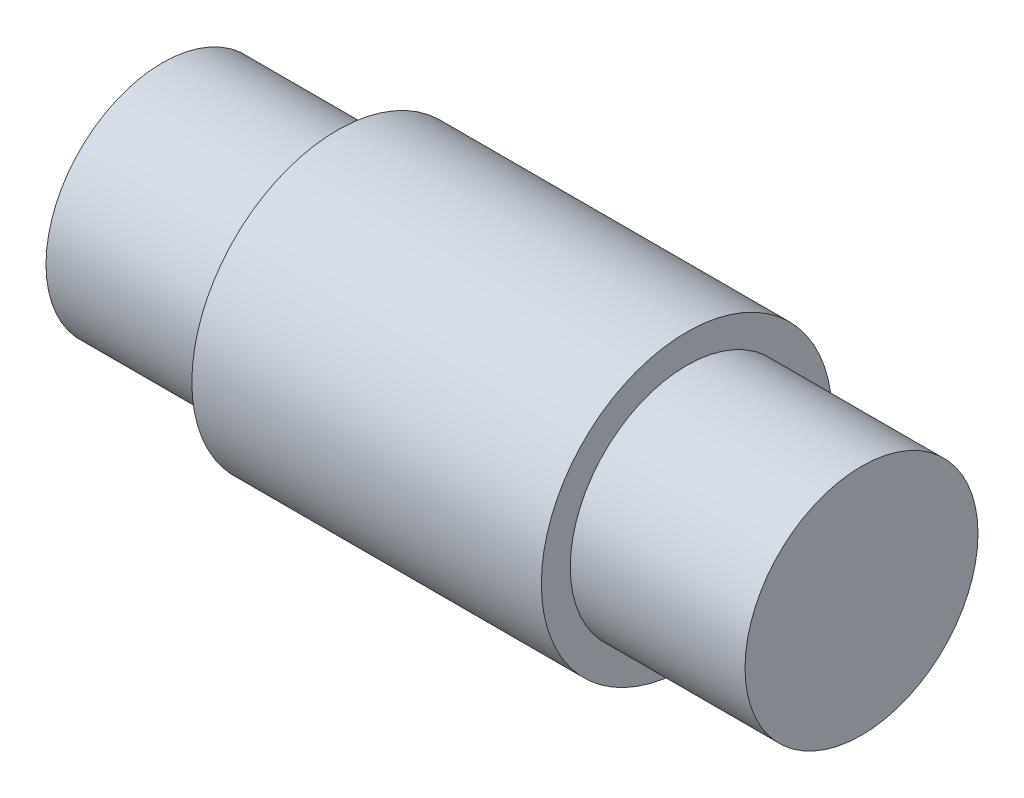
ISO-10303-21;
HEADER;
FILE_DESCRIPTION(('STEP AP214'),'2;1');
FILE_NAME('part.step','',(''),(''),'','','');
FILE_SCHEMA(('AUTOMOTIVE_DESIGN { 1 0 10303 214 1 1 1 1 }'));
ENDSEC;
DATA;
#1=APPLICATION_CONTEXT('core data for automotive mechanical design processes');
#2=APPLICATION_PROTOCOL_DEFINITION('international standard','automotive_design',2000,#1);
#3=PRODUCT_CONTEXT('',#1,'mechanical');
#4=PRODUCT('Part','Part','',(#3));
#5=PRODUCT_RELATED_PRODUCT_CATEGORY('part','',(#4));
#6=PRODUCT_DEFINITION_FORMATION('','',#4);
#7=PRODUCT_DEFINITION_CONTEXT('part definition',#1,'design');
#8=PRODUCT_DEFINITION('design','',#6,#7);
#9=PRODUCT_DEFINITION_SHAPE('','',#8);
#10=(LENGTH_UNIT() NAMED_UNIT(*) SI_UNIT(.MILLI.,.METRE.));
#11=(NAMED_UNIT(*) PLANE_ANGLE_UNIT() SI_UNIT($,.RADIAN.));
#12=(NAMED_UNIT(*) SI_UNIT($,.STERADIAN.) SOLID_ANGLE_UNIT());
#13=UNCERTAINTY_MEASURE_WITH_UNIT(LENGTH_MEASURE(1.E-05),#10,'distance_accuracy_value','');
#14=(GEOMETRIC_REPRESENTATION_CONTEXT(3) GLOBAL_UNCERTAINTY_ASSIGNED_CONTEXT((#13)) GLOBAL_UNIT_ASSIGNED_CONTEXT((#10,
#11,#12)) REPRESENTATION_CONTEXT('',''));
#15=CARTESIAN_POINT('',(0.,0.,0.));
#16=DIRECTION('',(0.,0.,1.));
#17=DIRECTION('',(1.,0.,0.));
#18=AXIS2_PLACEMENT_3D('',#15,#16,#17);
#19=CARTESIAN_POINT('',(0.,3.175,0.));
#20=DIRECTION('',(1.,0.,0.));
#21=DIRECTION('',(0.,0.,-1.));
#22=AXIS2_PLACEMENT_3D('',#19,#20,#21);
#23=PLANE('',#22);
#24=CARTESIAN_POINT('',(0.,0.,0.));
#25=DIRECTION('',(-1.,0.,0.));
#26=DIRECTION('',(0.,0.,1.));
#27=AXIS2_PLACEMENT_3D('',#24,#25,#26);
#28=CIRCLE('',#27,3.175);
#29=CARTESIAN_POINT('',(0.,0.,3.175));
#30=VERTEX_POINT('',#29);
#31=EDGE_CURVE('E53',#30,#30,#28,.T.);
#32=ORIENTED_EDGE('',*,*,#31,.T.);
#33=EDGE_LOOP('',(#32));
#34=FACE_BOUND('',#33,.T.);
#35=ADVANCED_FACE('F31',(#34),#23,.F.);
#36=CARTESIAN_POINT('',(19.05,0.,0.));
#37=DIRECTION('',(-1.,0.,0.));
#38=DIRECTION('',(0.,0.,1.));
#39=AXIS2_PLACEMENT_3D('',#36,#37,#38);
#40=PLANE('',#39);
#41=CARTESIAN_POINT('',(19.05,0.,0.));
#42=DIRECTION('',(-1.,0.,0.));
#43=DIRECTION('',(0.,0.,1.));
#44=AXIS2_PLACEMENT_3D('',#41,#42,#43);
#45=CIRCLE('',#44,3.175);
#46=CARTESIAN_POINT('',(19.05,0.,3.175));
#47=VERTEX_POINT('',#46);
#48=EDGE_CURVE('E10',#47,#47,#45,.T.);
#49=ORIENTED_EDGE('',*,*,#48,.F.);
#50=EDGE_LOOP('',(#49));
#51=FACE_BOUND('',#50,.T.);
#52=ADVANCED_FACE('F83',(#51),#40,.F.);
#53=CARTESIAN_POINT('',(0.,0.,0.));
#54=DIRECTION('',(-1.,0.,0.));
#55=DIRECTION('',(0.,0.,1.));
#56=AXIS2_PLACEMENT_3D('',#53,#54,#55);
#57=CYLINDRICAL_SURFACE('',#56,3.175);
#58=CARTESIAN_POINT('',(14.2875,0.,0.));
#59=DIRECTION('',(-1.,0.,0.));
#60=DIRECTION('',(0.,0.,1.));
#61=AXIS2_PLACEMENT_3D('',#58,#59,#60);
#62=CIRCLE('',#61,3.175);
#63=CARTESIAN_POINT('',(14.2875,0.,3.175));
#64=VERTEX_POINT('',#63);
#65=EDGE_CURVE('E37',#64,#64,#62,.T.);
#66=ORIENTED_EDGE('',*,*,#65,.F.);
#67=EDGE_LOOP('',(#66));
#68=FACE_BOUND('',#67,.T.);
#69=ORIENTED_EDGE('',*,*,#48,.T.);
#70=EDGE_LOOP('',(#69));
#71=FACE_BOUND('',#70,.T.);
#72=ADVANCED_FACE('F78',(#68,#71),#57,.T.);
#73=CARTESIAN_POINT('',(14.2875,3.175,0.));
#74=DIRECTION('',(-1.,0.,0.));
#75=DIRECTION('',(0.,0.,1.));
#76=AXIS2_PLACEMENT_3D('',#73,#74,#75);
#77=PLANE('',#76);
#78=CARTESIAN_POINT('',(14.2875,0.,0.));
#79=DIRECTION('',(-1.,0.,0.));
#80=DIRECTION('',(0.,0.,1.));
#81=AXIS2_PLACEMENT_3D('',#78,#79,#80);
#82=CIRCLE('',#81,3.9624);
#83=CARTESIAN_POINT('',(14.2875,0.,3.9624));
#84=VERTEX_POINT('',#83);
#85=EDGE_CURVE('E41',#84,#84,#82,.T.);
#86=ORIENTED_EDGE('',*,*,#85,.F.);
#87=EDGE_LOOP('',(#86));
#88=FACE_BOUND('',#87,.T.);
#89=ORIENTED_EDGE('',*,*,#65,.T.);
#90=EDGE_LOOP('',(#89));
#91=FACE_BOUND('',#90,.T.);
#92=ADVANCED_FACE('F73',(#88,#91),#77,.F.);
#93=CARTESIAN_POINT('',(0.,0.,0.));
#94=DIRECTION('',(-1.,0.,0.));
#95=DIRECTION('',(0.,0.,1.));
#96=AXIS2_PLACEMENT_3D('',#93,#94,#95);
#97=CYLINDRICAL_SURFACE('',#96,3.9624);
#98=CARTESIAN_POINT('',(4.7625,0.,0.));
#99=DIRECTION('',(-1.,0.,0.));
#100=DIRECTION('',(0.,0.,1.));
#101=AXIS2_PLACEMENT_3D('',#98,#99,#100);
#102=CIRCLE('',#101,3.9624);
#103=CARTESIAN_POINT('',(4.7625,0.,3.9624));
#104=VERTEX_POINT('',#103);
#105=EDGE_CURVE('E45',#104,#104,#102,.T.);
#106=ORIENTED_EDGE('',*,*,#105,.F.);
#107=EDGE_LOOP('',(#106));
#108=FACE_BOUND('',#107,.T.);
#109=ORIENTED_EDGE('',*,*,#85,.T.);
#110=EDGE_LOOP('',(#109));
#111=FACE_BOUND('',#110,.T.);
#112=ADVANCED_FACE('F67',(#108,#111),#97,.T.);
#113=CARTESIAN_POINT('',(4.7625,3.9624,0.));
#114=DIRECTION('',(1.,0.,0.));
#115=DIRECTION('',(0.,0.,-1.));
#116=AXIS2_PLACEMENT_3D('',#113,#114,#115);
#117=PLANE('',#116);
#118=CARTESIAN_POINT('',(4.7625,0.,0.));
#119=DIRECTION('',(-1.,0.,0.));
#120=DIRECTION('',(0.,0.,1.));
#121=AXIS2_PLACEMENT_3D('',#118,#119,#120);
#122=CIRCLE('',#121,3.175);
#123=CARTESIAN_POINT('',(4.7625,0.,3.175));
#124=VERTEX_POINT('',#123);
#125=EDGE_CURVE('E50',#124,#124,#122,.T.);
#126=ORIENTED_EDGE('',*,*,#125,.F.);
#127=EDGE_LOOP('',(#126));
#128=FACE_BOUND('',#127,.T.);
#129=ORIENTED_EDGE('',*,*,#105,.T.);
#130=EDGE_LOOP('',(#129));
#131=FACE_BOUND('',#130,.T.);
#132=ADVANCED_FACE('F61',(#128,#131),#117,.F.);
#133=CARTESIAN_POINT('',(0.,0.,0.));
#134=DIRECTION('',(-1.,0.,0.));
#135=DIRECTION('',(0.,0.,1.));
#136=AXIS2_PLACEMENT_3D('',#133,#134,#135);
#137=CYLINDRICAL_SURFACE('',#136,3.175);
#138=ORIENTED_EDGE('',*,*,#31,.F.);
#139=EDGE_LOOP('',(#138));
#140=FACE_BOUND('',#139,.T.);
#141=ORIENTED_EDGE('',*,*,#125,.T.);
#142=EDGE_LOOP('',(#141));
#143=FACE_BOUND('',#142,.T.);
#144=ADVANCED_FACE('F58',(#140,#143),#137,.T.);
#145=CLOSED_SHELL('',(#35,#52,#72,#92,#112,#132,#144));
#146=MANIFOLD_SOLID_BREP('B2',#145);
#147=ADVANCED_BREP_SHAPE_REPRESENTATION('',(#18,#146),#14);
#148=SHAPE_DEFINITION_REPRESENTATION(#9,#147);
ENDSEC;
END-ISO-10303-21;
